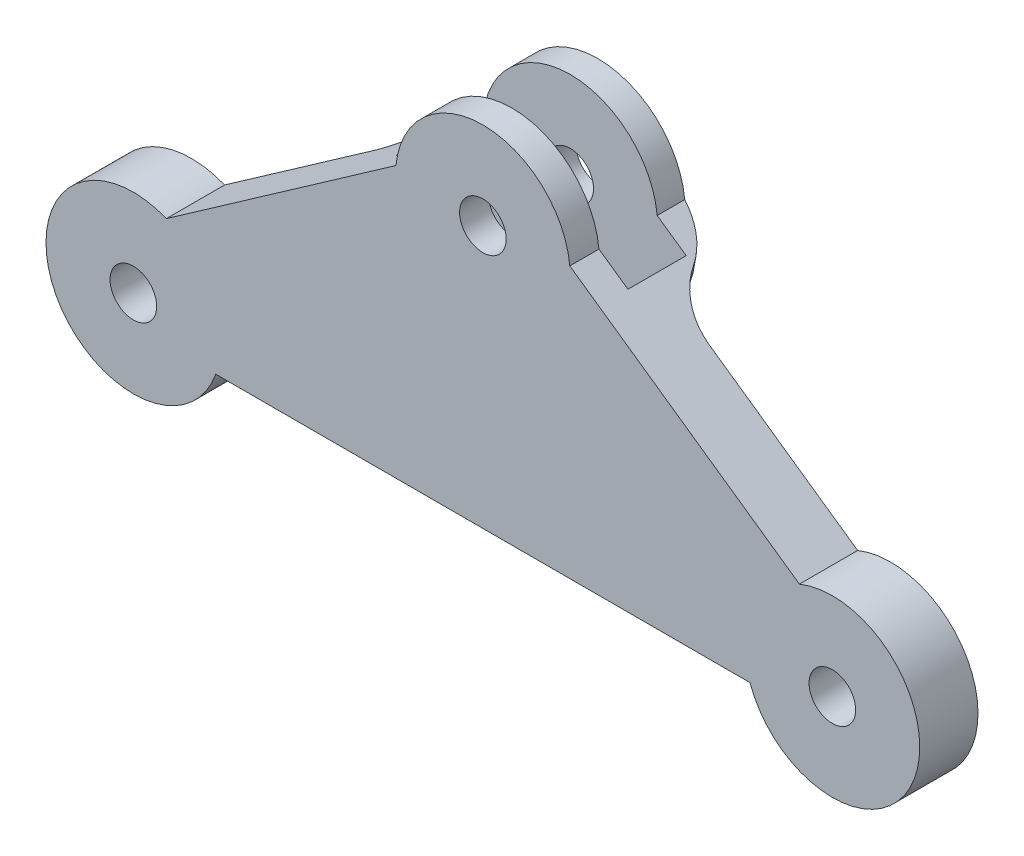
ISO-10303-21;
HEADER;
FILE_DESCRIPTION(('STEP AP214'),'2;1');
FILE_NAME('part.step','',(''),(''),'','','');
FILE_SCHEMA(('AUTOMOTIVE_DESIGN { 1 0 10303 214 1 1 1 1 }'));
ENDSEC;
DATA;
#1=APPLICATION_CONTEXT('core data for automotive mechanical design processes');
#2=APPLICATION_PROTOCOL_DEFINITION('international standard','automotive_design',2000,#1);
#3=PRODUCT_CONTEXT('',#1,'mechanical');
#4=PRODUCT('Part','Part','',(#3));
#5=PRODUCT_RELATED_PRODUCT_CATEGORY('part','',(#4));
#6=PRODUCT_DEFINITION_FORMATION('','',#4);
#7=PRODUCT_DEFINITION_CONTEXT('part definition',#1,'design');
#8=PRODUCT_DEFINITION('design','',#6,#7);
#9=PRODUCT_DEFINITION_SHAPE('','',#8);
#10=(LENGTH_UNIT() NAMED_UNIT(*) SI_UNIT(.MILLI.,.METRE.));
#11=(NAMED_UNIT(*) PLANE_ANGLE_UNIT() SI_UNIT($,.RADIAN.));
#12=(NAMED_UNIT(*) SI_UNIT($,.STERADIAN.) SOLID_ANGLE_UNIT());
#13=UNCERTAINTY_MEASURE_WITH_UNIT(LENGTH_MEASURE(1.E-05),#10,'distance_accuracy_value','');
#14=(GEOMETRIC_REPRESENTATION_CONTEXT(3) GLOBAL_UNCERTAINTY_ASSIGNED_CONTEXT((#13)) GLOBAL_UNIT_ASSIGNED_CONTEXT((#10,
#11,#12)) REPRESENTATION_CONTEXT('',''));
#15=CARTESIAN_POINT('',(0.,0.,0.));
#16=DIRECTION('',(0.,0.,1.));
#17=DIRECTION('',(1.,0.,0.));
#18=AXIS2_PLACEMENT_3D('',#15,#16,#17);
#19=CARTESIAN_POINT('',(60.0000000000001,40.,20.));
#20=DIRECTION('',(0.,0.,-1.));
#21=DIRECTION('',(-1.,0.,0.));
#22=AXIS2_PLACEMENT_3D('',#19,#20,#21);
#23=CYLINDRICAL_SURFACE('',#22,15.);
#24=CARTESIAN_POINT('',(60.0000000000001,40.,5.));
#25=DIRECTION('',(0.,0.,1.));
#26=DIRECTION('',(1.,0.,0.));
#27=AXIS2_PLACEMENT_3D('',#24,#25,#26);
#28=CIRCLE('',#27,15.);
#29=CARTESIAN_POINT('',(74.9259799150159,41.4883291223871,5.));
#30=VERTEX_POINT('',#29);
#31=CARTESIAN_POINT('',(45.0740200849843,41.4883291223871,5.));
#32=VERTEX_POINT('',#31);
#33=EDGE_CURVE('E133',#30,#32,#28,.T.);
#34=ORIENTED_EDGE('',*,*,#33,.F.);
#35=DIRECTION('',(0.,0.,-1.));
#36=VECTOR('',#35,1.);
#37=CARTESIAN_POINT('',(74.9259799150159,41.4883291223871,20.));
#38=LINE('',#37,#36);
#39=CARTESIAN_POINT('',(74.9259799150159,41.4883291223871,0.272963335595823));
#40=VERTEX_POINT('',#39);
#41=EDGE_CURVE('E212',#30,#40,#38,.T.);
#42=ORIENTED_EDGE('',*,*,#41,.T.);
#43=CARTESIAN_POINT('',(60.,40.,0.272963335595823));
#44=DIRECTION('',(0.,0.,1.));
#45=DIRECTION('',(1.,0.,0.));
#46=AXIS2_PLACEMENT_3D('',#43,#44,#45);
#47=CIRCLE('',#46,15.);
#48=CARTESIAN_POINT('',(45.0740200849843,41.4883291223871,0.272963335595816));
#49=VERTEX_POINT('',#48);
#50=EDGE_CURVE('E275',#40,#49,#47,.T.);
#51=ORIENTED_EDGE('',*,*,#50,.T.);
#52=DIRECTION('',(0.,0.,-1.));
#53=VECTOR('',#52,1.);
#54=CARTESIAN_POINT('',(45.0740200849843,41.4883291223871,20.));
#55=LINE('',#54,#53);
#56=EDGE_CURVE('E210',#32,#49,#55,.T.);
#57=ORIENTED_EDGE('',*,*,#56,.F.);
#58=EDGE_LOOP('',(#34,#42,#51,#57));
#59=FACE_BOUND('',#58,.T.);
#60=ADVANCED_FACE('F39',(#59),#23,.T.);
#61=CARTESIAN_POINT('',(60.0000000000001,40.,20.));
#62=DIRECTION('',(0.,0.,-1.));
#63=DIRECTION('',(-1.,0.,0.));
#64=AXIS2_PLACEMENT_3D('',#61,#62,#63);
#65=CYLINDRICAL_SURFACE('',#64,4.00000000000001);
#66=CARTESIAN_POINT('',(60.0000000000001,40.,0.));
#67=DIRECTION('',(0.,0.,1.));
#68=DIRECTION('',(1.,0.,0.));
#69=AXIS2_PLACEMENT_3D('',#66,#67,#68);
#70=CIRCLE('',#69,4.00000000000001);
#71=CARTESIAN_POINT('',(64.0000000000001,40.,0.));
#72=VERTEX_POINT('',#71);
#73=EDGE_CURVE('E188',#72,#72,#70,.T.);
#74=ORIENTED_EDGE('',*,*,#73,.F.);
#75=EDGE_LOOP('',(#74));
#76=FACE_BOUND('',#75,.T.);
#77=CARTESIAN_POINT('',(60.0000000000001,40.,5.));
#78=DIRECTION('',(0.,0.,1.));
#79=DIRECTION('',(1.,0.,0.));
#80=AXIS2_PLACEMENT_3D('',#77,#78,#79);
#81=CIRCLE('',#80,4.00000000000001);
#82=CARTESIAN_POINT('',(64.0000000000001,40.,5.));
#83=VERTEX_POINT('',#82);
#84=EDGE_CURVE('E283',#83,#83,#81,.T.);
#85=ORIENTED_EDGE('',*,*,#84,.T.);
#86=EDGE_LOOP('',(#85));
#87=FACE_BOUND('',#86,.T.);
#88=ADVANCED_FACE('F333',(#76,#87),#65,.F.);
#89=CARTESIAN_POINT('',(0.,0.,0.));
#90=DIRECTION('',(0.,0.,1.));
#91=DIRECTION('',(1.,0.,0.));
#92=AXIS2_PLACEMENT_3D('',#89,#90,#91);
#93=PLANE('',#92);
#94=CARTESIAN_POINT('',(60.,40.,0.));
#95=DIRECTION('',(0.,0.,1.));
#96=DIRECTION('',(1.,0.,0.));
#97=AXIS2_PLACEMENT_3D('',#94,#95,#96);
#98=CIRCLE('',#97,12.6794919243112);
#99=CARTESIAN_POINT('',(72.5645259644283,38.296414737111,0.));
#100=VERTEX_POINT('',#99);
#101=EDGE_CURVE('E61',#100,#100,#98,.F.);
#102=ORIENTED_EDGE('',*,*,#101,.T.);
#103=EDGE_LOOP('',(#102));
#104=FACE_BOUND('',#103,.T.);
#105=ORIENTED_EDGE('',*,*,#73,.T.);
#106=EDGE_LOOP('',(#105));
#107=FACE_BOUND('',#106,.T.);
#108=ADVANCED_FACE('F253',(#104,#107),#93,.F.);
#109=CARTESIAN_POINT('',(0.,0.,20.));
#110=DIRECTION('',(0.,0.,-1.));
#111=DIRECTION('',(-1.,0.,0.));
#112=AXIS2_PLACEMENT_3D('',#109,#110,#111);
#113=CYLINDRICAL_SURFACE('',#112,15.);
#114=CARTESIAN_POINT('',(0.,0.,10.));
#115=DIRECTION('',(0.,0.,-1.));
#116=DIRECTION('',(-1.,0.,0.));
#117=AXIS2_PLACEMENT_3D('',#114,#115,#116);
#118=CIRCLE('',#117,15.);
#119=CARTESIAN_POINT('',(14.142135623731,-5.,10.));
#120=VERTEX_POINT('',#119);
#121=CARTESIAN_POINT('',(5.66074705825357,13.8908582435527,10.));
#122=VERTEX_POINT('',#121);
#123=EDGE_CURVE('E171',#120,#122,#118,.T.);
#124=ORIENTED_EDGE('',*,*,#123,.F.);
#125=DIRECTION('',(0.,0.,-1.));
#126=VECTOR('',#125,1.);
#127=CARTESIAN_POINT('',(14.142135623731,-5.,20.));
#128=LINE('',#127,#126);
#129=CARTESIAN_POINT('',(14.142135623731,-5.,20.));
#130=VERTEX_POINT('',#129);
#131=EDGE_CURVE('E222',#130,#120,#128,.T.);
#132=ORIENTED_EDGE('',*,*,#131,.F.);
#133=CARTESIAN_POINT('',(0.,0.,20.));
#134=DIRECTION('',(0.,0.,1.));
#135=DIRECTION('',(1.,0.,0.));
#136=AXIS2_PLACEMENT_3D('',#133,#134,#135);
#137=CIRCLE('',#136,15.);
#138=CARTESIAN_POINT('',(5.66074705825357,13.8908582435527,20.));
#139=VERTEX_POINT('',#138);
#140=EDGE_CURVE('E192',#139,#130,#137,.T.);
#141=ORIENTED_EDGE('',*,*,#140,.F.);
#142=DIRECTION('',(0.,0.,-1.));
#143=VECTOR('',#142,1.);
#144=CARTESIAN_POINT('',(5.66074705825357,13.8908582435527,20.));
#145=LINE('',#144,#143);
#146=EDGE_CURVE('E207',#139,#122,#145,.T.);
#147=ORIENTED_EDGE('',*,*,#146,.T.);
#148=EDGE_LOOP('',(#124,#132,#141,#147));
#149=FACE_BOUND('',#148,.T.);
#150=ADVANCED_FACE('F248',(#149),#113,.T.);
#151=CARTESIAN_POINT('',(105.857864376269,-5.,20.));
#152=DIRECTION('',(0.,1.,0.));
#153=DIRECTION('',(-1.,0.,0.));
#154=AXIS2_PLACEMENT_3D('',#151,#152,#153);
#155=PLANE('',#154);
#156=DIRECTION('',(-1.,0.,0.));
#157=VECTOR('',#156,1.);
#158=CARTESIAN_POINT('',(0.,-5.,10.));
#159=LINE('',#158,#157);
#160=CARTESIAN_POINT('',(105.857864376269,-5.,10.));
#161=VERTEX_POINT('',#160);
#162=EDGE_CURVE('E169',#161,#120,#159,.T.);
#163=ORIENTED_EDGE('',*,*,#162,.F.);
#164=DIRECTION('',(0.,0.,-1.));
#165=VECTOR('',#164,1.);
#166=CARTESIAN_POINT('',(105.857864376269,-5.,20.));
#167=LINE('',#166,#165);
#168=CARTESIAN_POINT('',(105.857864376269,-5.,20.));
#169=VERTEX_POINT('',#168);
#170=EDGE_CURVE('E219',#169,#161,#167,.T.);
#171=ORIENTED_EDGE('',*,*,#170,.F.);
#172=DIRECTION('',(1.,0.,0.));
#173=VECTOR('',#172,1.);
#174=CARTESIAN_POINT('',(105.857864376269,-5.,20.));
#175=LINE('',#174,#173);
#176=EDGE_CURVE('E197',#130,#169,#175,.T.);
#177=ORIENTED_EDGE('',*,*,#176,.F.);
#178=ORIENTED_EDGE('',*,*,#131,.T.);
#179=EDGE_LOOP('',(#163,#171,#177,#178));
#180=FACE_BOUND('',#179,.T.);
#181=ADVANCED_FACE('F252',(#180),#155,.F.);
#182=CARTESIAN_POINT('',(120.,0.,20.));
#183=DIRECTION('',(0.,0.,-1.));
#184=DIRECTION('',(-1.,0.,0.));
#185=AXIS2_PLACEMENT_3D('',#182,#183,#184);
#186=CYLINDRICAL_SURFACE('',#185,15.);
#187=CARTESIAN_POINT('',(120.,0.,10.));
#188=DIRECTION('',(0.,0.,-1.));
#189=DIRECTION('',(-1.,0.,0.));
#190=AXIS2_PLACEMENT_3D('',#187,#188,#189);
#191=CIRCLE('',#190,15.);
#192=CARTESIAN_POINT('',(114.339252941747,13.8908582435527,10.));
#193=VERTEX_POINT('',#192);
#194=EDGE_CURVE('E167',#193,#161,#191,.T.);
#195=ORIENTED_EDGE('',*,*,#194,.F.);
#196=DIRECTION('',(0.,0.,-1.));
#197=VECTOR('',#196,1.);
#198=CARTESIAN_POINT('',(114.339252941747,13.8908582435527,20.));
#199=LINE('',#198,#197);
#200=CARTESIAN_POINT('',(114.339252941747,13.8908582435527,20.));
#201=VERTEX_POINT('',#200);
#202=EDGE_CURVE('E216',#201,#193,#199,.T.);
#203=ORIENTED_EDGE('',*,*,#202,.F.);
#204=CARTESIAN_POINT('',(120.,0.,20.));
#205=DIRECTION('',(0.,0.,1.));
#206=DIRECTION('',(1.,0.,0.));
#207=AXIS2_PLACEMENT_3D('',#204,#205,#206);
#208=CIRCLE('',#207,15.);
#209=EDGE_CURVE('E199',#169,#201,#208,.T.);
#210=ORIENTED_EDGE('',*,*,#209,.F.);
#211=ORIENTED_EDGE('',*,*,#170,.T.);
#212=EDGE_LOOP('',(#195,#203,#210,#211));
#213=FACE_BOUND('',#212,.T.);
#214=ADVANCED_FACE('F257',(#213),#186,.T.);
#215=CARTESIAN_POINT('',(74.9259799150159,41.4883291223871,20.));
#216=DIRECTION('',(-0.573576436351047,-0.819152044288991,0.));
#217=DIRECTION('',(0.819152044288991,-0.573576436351047,0.));
#218=AXIS2_PLACEMENT_3D('',#215,#216,#217);
#219=PLANE('',#218);
#220=DIRECTION('',(0.,0.,-1.));
#221=VECTOR('',#220,1.);
#222=CARTESIAN_POINT('',(79.9002794082404,38.0052871199185,15.));
#223=LINE('',#222,#221);
#224=CARTESIAN_POINT('',(79.9002794082404,38.0052871199185,15.));
#225=VERTEX_POINT('',#224);
#226=CARTESIAN_POINT('',(79.9002794082404,38.0052871199185,5.));
#227=VERTEX_POINT('',#226);
#228=EDGE_CURVE('E143',#225,#227,#223,.T.);
#229=ORIENTED_EDGE('',*,*,#228,.F.);
#230=DIRECTION('',(-0.819152044288991,0.573576436351047,0.));
#231=VECTOR('',#230,1.);
#232=CARTESIAN_POINT('',(74.9259799150159,41.4883291223871,15.));
#233=LINE('',#232,#231);
#234=CARTESIAN_POINT('',(74.9259799150159,41.4883291223871,15.));
#235=VERTEX_POINT('',#234);
#236=EDGE_CURVE('E155',#225,#235,#233,.T.);
#237=ORIENTED_EDGE('',*,*,#236,.T.);
#238=CARTESIAN_POINT('',(74.9259799150159,41.4883291223871,20.));
#239=VERTEX_POINT('',#238);
#240=EDGE_CURVE('E213',#239,#235,#38,.T.);
#241=ORIENTED_EDGE('',*,*,#240,.F.);
#242=DIRECTION('',(-0.819152044288991,0.573576436351047,0.));
#243=VECTOR('',#242,1.);
#244=CARTESIAN_POINT('',(74.9259799150159,41.4883291223871,20.));
#245=LINE('',#244,#243);
#246=EDGE_CURVE('E201',#201,#239,#245,.T.);
#247=ORIENTED_EDGE('',*,*,#246,.F.);
#248=ORIENTED_EDGE('',*,*,#202,.T.);
#249=DIRECTION('',(0.819152044288991,-0.573576436351047,0.));
#250=VECTOR('',#249,1.);
#251=CARTESIAN_POINT('',(44.1430311253552,63.042781913231,10.));
#252=LINE('',#251,#250);
#253=CARTESIAN_POINT('',(88.8417291860941,31.7444165829418,10.));
#254=VERTEX_POINT('',#253);
#255=EDGE_CURVE('E165',#254,#193,#252,.T.);
#256=ORIENTED_EDGE('',*,*,#255,.F.);
#257=CARTESIAN_POINT('',(88.8417291860941,31.7444165829418,10.));
#258=CARTESIAN_POINT('',(88.5788646634974,31.9284763031919,10.0000255001792));
#259=CARTESIAN_POINT('',(88.3160233764491,32.1125197537359,9.986196673985));
#260=CARTESIAN_POINT('',(87.7922957510652,32.4792377849983,9.93132691072668));
#261=CARTESIAN_POINT('',(87.5314090843992,32.6619125956163,9.89029065244057));
#262=CARTESIAN_POINT('',(87.0135741722543,33.0245045046483,9.78153723800248));
#263=CARTESIAN_POINT('',(86.7566235005208,33.2044233019442,9.71383726734733));
#264=CARTESIAN_POINT('',(86.2482647211369,33.5603799513839,9.55239839257563));
#265=CARTESIAN_POINT('',(85.9968567882128,33.736417681183,9.45865866885919));
#266=CARTESIAN_POINT('',(85.5014077056254,34.0833348636098,9.24590383294871));
#267=CARTESIAN_POINT('',(85.2573643866132,34.2542158352319,9.12689624841612));
#268=CARTESIAN_POINT('',(84.7781930723212,34.589735201593,8.86435599082266));
#269=CARTESIAN_POINT('',(84.5430681806626,34.7543714231531,8.72081487403467));
#270=CARTESIAN_POINT('',(84.0835121822615,35.076155997463,8.41010845893162));
#271=CARTESIAN_POINT('',(83.8590817295176,35.2333038922781,8.24294171830831));
#272=CARTESIAN_POINT('',(83.4226471533981,35.5388986724123,7.8859385531512));
#273=CARTESIAN_POINT('',(83.2106432971542,35.6873453706839,7.69610164154823));
#274=CARTESIAN_POINT('',(82.8005301683392,35.9745096749989,7.29449587586368));
#275=CARTESIAN_POINT('',(82.6024420040204,36.113212500885,7.08269486077136));
#276=CARTESIAN_POINT('',(82.222433751622,36.3792971437963,6.6386351492714));
#277=CARTESIAN_POINT('',(82.0405069863331,36.5066836362537,6.40638498130754));
#278=CARTESIAN_POINT('',(81.6946172778975,36.7488782174894,5.92259355518975));
#279=CARTESIAN_POINT('',(81.5306593095647,36.8636828228656,5.67104698726753));
#280=CARTESIAN_POINT('',(81.2228064617358,37.0792437075748,5.15027768461252));
#281=CARTESIAN_POINT('',(81.0789090066768,37.1800017903362,4.88105722556539));
#282=CARTESIAN_POINT('',(80.8225069046717,37.3595364749731,4.34611717396494));
#283=CARTESIAN_POINT('',(80.7085132309154,37.4393557046454,4.08146151289112));
#284=CARTESIAN_POINT('',(80.5013466891215,37.5844152788743,3.54028919713725));
#285=CARTESIAN_POINT('',(80.4081700253046,37.6496582812641,3.26377471577602));
#286=CARTESIAN_POINT('',(80.2443579515243,37.7643607301749,2.70166215618057));
#287=CARTESIAN_POINT('',(80.173671497133,37.813855918389,2.41608628901334));
#288=CARTESIAN_POINT('',(80.0559044549062,37.8963172891089,1.83791573454646));
#289=CARTESIAN_POINT('',(80.0088080313391,37.9292945599133,1.54532589427546));
#290=CARTESIAN_POINT('',(79.9494741133309,37.9708406165742,1.04349446731837));
#291=CARTESIAN_POINT('',(79.9310371056768,37.9837503483156,0.83531723647192));
#292=CARTESIAN_POINT('',(79.9064370265588,38.0009755091545,0.418104938181707));
#293=CARTESIAN_POINT('',(79.9002611480739,38.0052999058247,0.209070994606123));
#294=CARTESIAN_POINT('',(79.9002794082404,38.0052871199185,0.));
#295=B_SPLINE_CURVE_WITH_KNOTS('',3,(#257,#258,#259,#260,#261,#262,#263,#264,#265,#266,#267,
#268,#269,#270,#271,#272,#273,#274,#275,#276,#277,#278,#279,#280,#281,#282,#283,#284,#285,#286,
#287,#288,#289,#290,#291,#292,#293,#294),.UNSPECIFIED.,.F.,.F.,(4,2,2,2,2,2,2,2,2,2,2,2,2,2,2,2,
2,2,4),(0.,0.962356526071985,1.92454760157603,2.88611953065247,3.84772172858584,
4.80903785226378,5.77068550165329,6.73239188354244,7.69411893143467,8.65727462599246,
9.62003051624308,10.5830522838345,11.5459502952782,12.4417330517644,13.3373523374264,
14.2309241546345,15.1238953201716,15.7515580239126,16.3785647744018),.UNSPECIFIED.);
#296=CARTESIAN_POINT('',(81.1462567913851,37.1328443638018,5.00000000000178));
#297=VERTEX_POINT('',#296);
#298=EDGE_CURVE('E233',#254,#297,#295,.T.);
#299=ORIENTED_EDGE('',*,*,#298,.T.);
#300=CARTESIAN_POINT('',(81.1462567913841,37.1328443638025,5.));
#301=CARTESIAN_POINT('',(81.0813317284569,37.1783053822828,4.87798567770648));
#302=CARTESIAN_POINT('',(81.0141269923752,37.2253626450906,4.75780595543095));
#303=CARTESIAN_POINT('',(80.8753295721159,37.3225496450403,4.52129485162238));
#304=CARTESIAN_POINT('',(80.8037371659757,37.3726791874982,4.4049632269612));
#305=CARTESIAN_POINT('',(80.5827468021,37.5274183061557,4.06217879105021));
#306=CARTESIAN_POINT('',(80.427025844194,37.6364552947387,3.84173046370002));
#307=CARTESIAN_POINT('',(80.1022161321694,37.8638895035821,3.42068800503808));
#308=CARTESIAN_POINT('',(79.9332932931711,37.9821705488244,3.21990212758247));
#309=CARTESIAN_POINT('',(79.5821867919866,38.2280179676683,2.8363874075259));
#310=CARTESIAN_POINT('',(79.4000016907361,38.3555853489134,2.65366052956139));
#311=CARTESIAN_POINT('',(79.0244165783448,38.6185728758491,2.30732784043118));
#312=CARTESIAN_POINT('',(78.8310397335752,38.753976800272,2.14368450601262));
#313=CARTESIAN_POINT('',(78.4343460940479,39.0317446770288,1.83545036141048));
#314=CARTESIAN_POINT('',(78.2310282759125,39.1741093459396,1.69086151848544));
#315=CARTESIAN_POINT('',(77.8148867583245,39.4654947735168,1.42007841356208));
#316=CARTESIAN_POINT('',(77.6020162161403,39.6145483318169,1.2939916563296));
#317=CARTESIAN_POINT('',(77.1693965265858,39.9174718996209,1.06098378655808));
#318=CARTESIAN_POINT('',(76.9496476476513,40.071341721164,0.954061927177244));
#319=CARTESIAN_POINT('',(76.4069558361756,40.451338618484,0.716048108351853));
#320=CARTESIAN_POINT('',(76.0810553400192,40.6795366025989,0.594947214473777));
#321=CARTESIAN_POINT('',(75.4213777532882,41.141447821616,0.389029578535949));
#322=CARTESIAN_POINT('',(75.0875924839222,41.3751667833695,0.304252430671791));
#323=CARTESIAN_POINT('',(74.5851558003418,41.7269767366855,0.202206613691951));
#324=CARTESIAN_POINT('',(74.4181226904921,41.8439345793329,0.172454606432859));
#325=CARTESIAN_POINT('',(74.0832437635004,42.0784193284,0.120567273964103));
#326=CARTESIAN_POINT('',(73.9153978842294,42.1959462783231,0.0984325406540384));
#327=CARTESIAN_POINT('',(73.579611205463,42.4310666420257,0.0612977167867671));
#328=CARTESIAN_POINT('',(73.4116716914499,42.5486591557009,0.04627993439511));
#329=CARTESIAN_POINT('',(73.0755309311916,42.7840274499333,0.022704403896345));
#330=CARTESIAN_POINT('',(72.9073297665458,42.901803173354,0.0141449367194662));
#331=CARTESIAN_POINT('',(72.7390783373358,43.0196140924013,0.00851448376966913));
#332=B_SPLINE_CURVE_WITH_KNOTS('',3,(#300,#301,#302,#303,#304,#305,#306,#307,#308,#309,#310,
#311,#312,#313,#314,#315,#316,#317,#318,#319,#320,#321,#322,#323,#324,#325,#326,#327,#328,#329,
#330,#331),.UNSPECIFIED.,.F.,.F.,(4,2,2,2,2,2,2,2,2,2,2,2,2,2,2,4),(0.,0.436410591352148,
0.872793556809297,1.74482489303898,2.60726247602928,3.46979378046194,4.33059945820407,
5.1914939393054,6.05720774358409,6.92288780430292,8.16854740754378,9.41556139156545,
10.0336513968776,10.6517894199799,11.2683826639199,11.884811725551),.UNSPECIFIED.);
#333=EDGE_CURVE('E268',#297,#40,#332,.T.);
#334=ORIENTED_EDGE('',*,*,#333,.T.);
#335=ORIENTED_EDGE('',*,*,#41,.F.);
#336=DIRECTION('',(-0.819152044288991,0.573576436351047,0.));
#337=VECTOR('',#336,1.);
#338=CARTESIAN_POINT('',(74.9259799150159,41.4883291223871,5.));
#339=LINE('',#338,#337);
#340=EDGE_CURVE('E55',#227,#30,#339,.T.);
#341=ORIENTED_EDGE('',*,*,#340,.F.);
#342=EDGE_LOOP('',(#229,#237,#241,#247,#248,#256,#299,#334,#335,#341));
#343=FACE_BOUND('',#342,.T.);
#344=ADVANCED_FACE('F260',(#343),#219,.F.);
#345=CARTESIAN_POINT('',(5.66074705825357,13.8908582435527,20.));
#346=DIRECTION('',(0.573576436351047,-0.819152044288991,0.));
#347=DIRECTION('',(0.819152044288991,0.573576436351047,0.));
#348=AXIS2_PLACEMENT_3D('',#345,#346,#347);
#349=PLANE('',#348);
#350=CARTESIAN_POINT('',(45.0740200849843,41.4883291223871,20.));
#351=VERTEX_POINT('',#350);
#352=CARTESIAN_POINT('',(45.0740200849843,41.4883291223871,15.));
#353=VERTEX_POINT('',#352);
#354=EDGE_CURVE('E152',#351,#353,#55,.T.);
#355=ORIENTED_EDGE('',*,*,#354,.T.);
#356=DIRECTION('',(-0.819152044288991,-0.573576436351047,0.));
#357=VECTOR('',#356,1.);
#358=CARTESIAN_POINT('',(5.66074705825357,13.8908582435527,15.));
#359=LINE('',#358,#357);
#360=CARTESIAN_POINT('',(40.0997205917596,38.0052871199184,15.));
#361=VERTEX_POINT('',#360);
#362=EDGE_CURVE('E149',#353,#361,#359,.T.);
#363=ORIENTED_EDGE('',*,*,#362,.T.);
#364=DIRECTION('',(0.,0.,-1.));
#365=VECTOR('',#364,1.);
#366=CARTESIAN_POINT('',(40.0997205917596,38.0052871199184,15.));
#367=LINE('',#366,#365);
#368=CARTESIAN_POINT('',(40.0997205917596,38.0052871199184,5.));
#369=VERTEX_POINT('',#368);
#370=EDGE_CURVE('E11',#369,#361,#367,.F.);
#371=ORIENTED_EDGE('',*,*,#370,.F.);
#372=DIRECTION('',(-0.819152044288991,-0.573576436351047,0.));
#373=VECTOR('',#372,1.);
#374=CARTESIAN_POINT('',(5.66074705825357,13.8908582435527,5.));
#375=LINE('',#374,#373);
#376=EDGE_CURVE('E129',#32,#369,#375,.T.);
#377=ORIENTED_EDGE('',*,*,#376,.F.);
#378=ORIENTED_EDGE('',*,*,#56,.T.);
#379=CARTESIAN_POINT('',(45.0740200849842,41.488329122387,0.272963335595815));
#380=CARTESIAN_POINT('',(44.9450438492262,41.3980189898593,0.301441533586815));
#381=CARTESIAN_POINT('',(44.8164430085291,41.3079717117831,0.33241401620311));
#382=CARTESIAN_POINT('',(44.5601366775029,41.1285040867077,0.399544268717578));
#383=CARTESIAN_POINT('',(44.4324313028554,41.0390838207096,0.435702696077677));
#384=CARTESIAN_POINT('',(44.0507045407239,40.7717958643288,0.552307410292352));
#385=CARTESIAN_POINT('',(43.7982959475092,40.5950574646509,0.640834592549762));
#386=CARTESIAN_POINT('',(43.2980566086797,40.2447861086935,0.841167810964573));
#387=CARTESIAN_POINT('',(43.0502626504483,40.071278911217,0.953111014715926));
#388=CARTESIAN_POINT('',(42.562819259832,39.729967374657,1.2007120275425));
#389=CARTESIAN_POINT('',(42.3231667371835,39.5621608717475,1.33636071578411));
#390=CARTESIAN_POINT('',(41.8739509891355,39.2476166186818,1.61922405473557));
#391=CARTESIAN_POINT('',(41.6635604088024,39.1002995483643,1.76447962279021));
#392=CARTESIAN_POINT('',(41.2529159139683,38.8127631775571,2.07520440014704));
#393=CARTESIAN_POINT('',(41.0526654499514,38.6725462931224,2.24068042556481));
#394=CARTESIAN_POINT('',(40.6649231033736,38.4010461791655,2.59074160723918));
#395=CARTESIAN_POINT('',(40.477383311388,38.269729403103,2.77524753444843));
#396=CARTESIAN_POINT('',(40.1160288166337,38.01670626191,3.1631321369942));
#397=CARTESIAN_POINT('',(39.9422075267615,37.8949952844402,3.36650165144872));
#398=CARTESIAN_POINT('',(39.6095608680412,37.662073586444,3.79162901887604));
#399=CARTESIAN_POINT('',(39.450768347377,37.5508858664635,4.01342524800175));
#400=CARTESIAN_POINT('',(39.150290863839,37.340489267428,4.47363712496346));
#401=CARTESIAN_POINT('',(39.0086044486453,37.2412793714474,4.7120513592048));
#402=CARTESIAN_POINT('',(38.7425786195912,37.0550060805853,5.20628735518684));
#403=CARTESIAN_POINT('',(38.6184205032269,36.9680696315771,5.46225534685087));
#404=CARTESIAN_POINT('',(38.447528966753,36.8484100895218,5.85611899143741));
#405=CARTESIAN_POINT('',(38.3931037485393,36.8103011414598,5.98911483533084));
#406=CARTESIAN_POINT('',(38.2895275329724,36.7377762945407,6.25814305337251));
#407=CARTESIAN_POINT('',(38.2403768827285,36.703360638732,6.39417562665137));
#408=CARTESIAN_POINT('',(38.1939347227056,36.6708414881932,6.53159924422219));
#409=B_SPLINE_CURVE_WITH_KNOTS('',3,(#379,#380,#381,#382,#383,#384,#385,#386,#387,#388,#389,
#390,#391,#392,#393,#394,#395,#396,#397,#398,#399,#400,#401,#402,#403,#404,#405,#406,#407,#408),
.UNSPECIFIED.,.F.,.F.,(4,2,2,2,2,2,2,2,2,2,2,2,2,2,4),(0.,0.479978421846198,0.960017748109193,
1.92092581752942,2.88762881297007,3.85396067900573,4.73826841721057,5.6228750733862,
6.50393702978823,7.38457332682823,8.26709199680085,9.14953568757026,10.0405259206856,
10.4863832715589,10.9322699454841),.UNSPECIFIED.);
#410=CARTESIAN_POINT('',(38.8537432086164,37.1328443638027,4.99999999999915));
#411=VERTEX_POINT('',#410);
#412=EDGE_CURVE('E48',#49,#411,#409,.T.);
#413=ORIENTED_EDGE('',*,*,#412,.T.);
#414=CARTESIAN_POINT('',(40.0997205917596,38.0052871199184,0.));
#415=CARTESIAN_POINT('',(40.0997218477361,38.0052879993626,0.129598000573221));
#416=CARTESIAN_POINT('',(40.0973541126075,38.0036300933771,0.259178343966597));
#417=CARTESIAN_POINT('',(40.0878991978469,37.9970096907886,0.5180768446117));
#418=CARTESIAN_POINT('',(40.0808122155144,37.9920473323362,0.647395012597603));
#419=CARTESIAN_POINT('',(40.0525126067851,37.9722317329756,1.03445849648521));
#420=CARTESIAN_POINT('',(40.0242612664563,37.9524499315127,1.29148782135104));
#421=CARTESIAN_POINT('',(39.9496158543415,37.9001826512572,1.80025686918969));
#422=CARTESIAN_POINT('',(39.9033101477243,37.8677590464217,2.05201615641389));
#423=CARTESIAN_POINT('',(39.7932391990625,37.7906865384309,2.54979649601731));
#424=CARTESIAN_POINT('',(39.7294726813763,37.7460367420616,2.79581712771956));
#425=CARTESIAN_POINT('',(39.5854816325063,37.6452131242081,3.28007895096952));
#426=CARTESIAN_POINT('',(39.5052853129989,37.5890590567523,3.51833267686929));
#427=CARTESIAN_POINT('',(39.3293307667467,37.4658543570843,3.98620498003771));
#428=CARTESIAN_POINT('',(39.2335666346561,37.3987995899043,4.21582023961135));
#429=CARTESIAN_POINT('',(39.0274761238317,37.2544934606716,4.66529498463727));
#430=CARTESIAN_POINT('',(38.9171400170298,37.1772352869522,4.88514782064032));
#431=CARTESIAN_POINT('',(38.6830227749041,37.0133046291909,5.31395719674818));
#432=CARTESIAN_POINT('',(38.5592363877447,36.9266284677742,5.52290943309781));
#433=CARTESIAN_POINT('',(38.1523380267932,36.6417151681507,6.15850514594211));
#434=CARTESIAN_POINT('',(37.8471686997315,36.4280333049118,6.56450253849806));
#435=CARTESIAN_POINT('',(37.1904011576839,35.9681597211186,7.31586605382406));
#436=CARTESIAN_POINT('',(36.8387879996329,35.7219575373176,7.66121257882319));
#437=CARTESIAN_POINT('',(36.2629022711767,35.3187180091051,8.14703559297347));
#438=CARTESIAN_POINT('',(36.0513484387101,35.1705864208749,8.31042587309244));
#439=CARTESIAN_POINT('',(35.618211060371,34.8673003634814,8.61595977605336));
#440=CARTESIAN_POINT('',(35.3966302060317,34.71214777895,8.75810905701403));
#441=CARTESIAN_POINT('',(34.9448344615739,34.3957969929497,9.02043513431921));
#442=CARTESIAN_POINT('',(34.7146167403347,34.2345968091085,9.14060464861488));
#443=CARTESIAN_POINT('',(34.2471621560267,33.9072815854054,9.35816472474544));
#444=CARTESIAN_POINT('',(34.0099281047288,33.7411685143665,9.45556427588108));
#445=CARTESIAN_POINT('',(33.558103029722,33.4247971908946,9.61689914583586));
#446=CARTESIAN_POINT('',(33.344129069941,33.2749710112753,9.68342252549821));
#447=CARTESIAN_POINT('',(32.9128833893265,32.9730095348887,9.79786049305399));
#448=CARTESIAN_POINT('',(32.6956120108699,32.8208744778562,9.84577699938104));
#449=CARTESIAN_POINT('',(32.2589168667117,32.515097246017,9.92263672196951));
#450=CARTESIAN_POINT('',(32.0394940104328,32.361455707995,9.95158763136939));
#451=CARTESIAN_POINT('',(31.5994752879185,32.0533512815372,9.9902774504782));
#452=CARTESIAN_POINT('',(31.3788792107559,31.8988882454084,10.0000127797895));
#453=CARTESIAN_POINT('',(31.1582708139059,31.7444165829417,10.));
#454=B_SPLINE_CURVE_WITH_KNOTS('',3,(#414,#415,#416,#417,#418,#419,#420,#421,#422,#423,#424,
#425,#426,#427,#428,#429,#430,#431,#432,#433,#434,#435,#436,#437,#438,#439,#440,#441,#442,#443,
#444,#445,#446,#447,#448,#449,#450,#451,#452,#453),.UNSPECIFIED.,.F.,.F.,(4,2,2,2,2,2,2,2,2,2,2,
2,2,2,2,2,2,2,2,4),(0.,0.388726780101155,0.777437309563549,1.55433515886277,2.32747735571105,
3.10067605140894,3.87255804801385,4.64473352916348,5.41742713565608,6.19042354196554,
7.83637740979228,9.48286215072432,10.3988213755186,11.3145361729975,12.2305538057578,
13.1462091930383,13.9542112969922,14.7621300709738,15.5697209203474,16.3774622321856),.UNSPECIFIED.);
#455=CARTESIAN_POINT('',(31.1582708139059,31.7444165829417,10.));
#456=VERTEX_POINT('',#455);
#457=EDGE_CURVE('E227',#411,#456,#454,.T.);
#458=ORIENTED_EDGE('',*,*,#457,.T.);
#459=DIRECTION('',(0.819152044288991,0.573576436351047,0.));
#460=VECTOR('',#459,1.);
#461=CARTESIAN_POINT('',(-4.66423972489513,6.66122466607635,10.));
#462=LINE('',#461,#460);
#463=EDGE_CURVE('E173',#122,#456,#462,.T.);
#464=ORIENTED_EDGE('',*,*,#463,.F.);
#465=ORIENTED_EDGE('',*,*,#146,.F.);
#466=DIRECTION('',(-0.819152044288991,-0.573576436351047,0.));
#467=VECTOR('',#466,1.);
#468=CARTESIAN_POINT('',(5.66074705825357,13.8908582435527,20.));
#469=LINE('',#468,#467);
#470=EDGE_CURVE('E205',#351,#139,#469,.T.);
#471=ORIENTED_EDGE('',*,*,#470,.F.);
#472=EDGE_LOOP('',(#355,#363,#371,#377,#378,#413,#458,#464,#465,#471));
#473=FACE_BOUND('',#472,.T.);
#474=ADVANCED_FACE('F148',(#473),#349,.F.);
#475=CARTESIAN_POINT('',(120.,0.,20.));
#476=DIRECTION('',(0.,0.,-1.));
#477=DIRECTION('',(-1.,0.,0.));
#478=AXIS2_PLACEMENT_3D('',#475,#476,#477);
#479=CYLINDRICAL_SURFACE('',#478,4.00000000000001);
#480=CARTESIAN_POINT('',(120.,0.,20.));
#481=DIRECTION('',(0.,0.,1.));
#482=DIRECTION('',(1.,0.,0.));
#483=AXIS2_PLACEMENT_3D('',#480,#481,#482);
#484=CIRCLE('',#483,4.00000000000001);
#485=CARTESIAN_POINT('',(124.,0.,20.));
#486=VERTEX_POINT('',#485);
#487=EDGE_CURVE('E185',#486,#486,#484,.T.);
#488=ORIENTED_EDGE('',*,*,#487,.T.);
#489=EDGE_LOOP('',(#488));
#490=FACE_BOUND('',#489,.T.);
#491=CARTESIAN_POINT('',(120.,0.,10.));
#492=DIRECTION('',(0.,0.,-1.));
#493=DIRECTION('',(-1.,0.,0.));
#494=AXIS2_PLACEMENT_3D('',#491,#492,#493);
#495=CIRCLE('',#494,4.00000000000001);
#496=CARTESIAN_POINT('',(116.,0.,10.));
#497=VERTEX_POINT('',#496);
#498=EDGE_CURVE('E179',#497,#497,#495,.F.);
#499=ORIENTED_EDGE('',*,*,#498,.F.);
#500=EDGE_LOOP('',(#499));
#501=FACE_BOUND('',#500,.T.);
#502=ADVANCED_FACE('F352',(#490,#501),#479,.F.);
#503=CARTESIAN_POINT('',(0.,0.,20.));
#504=DIRECTION('',(0.,0.,-1.));
#505=DIRECTION('',(-1.,0.,0.));
#506=AXIS2_PLACEMENT_3D('',#503,#504,#505);
#507=CYLINDRICAL_SURFACE('',#506,4.);
#508=CARTESIAN_POINT('',(0.,0.,20.));
#509=DIRECTION('',(0.,0.,1.));
#510=DIRECTION('',(1.,0.,0.));
#511=AXIS2_PLACEMENT_3D('',#508,#509,#510);
#512=CIRCLE('',#511,4.);
#513=CARTESIAN_POINT('',(4.,0.,20.));
#514=VERTEX_POINT('',#513);
#515=EDGE_CURVE('E182',#514,#514,#512,.T.);
#516=ORIENTED_EDGE('',*,*,#515,.T.);
#517=EDGE_LOOP('',(#516));
#518=FACE_BOUND('',#517,.T.);
#519=CARTESIAN_POINT('',(0.,0.,10.));
#520=DIRECTION('',(0.,0.,-1.));
#521=DIRECTION('',(-1.,0.,0.));
#522=AXIS2_PLACEMENT_3D('',#519,#520,#521);
#523=CIRCLE('',#522,4.);
#524=CARTESIAN_POINT('',(-4.,0.,10.));
#525=VERTEX_POINT('',#524);
#526=EDGE_CURVE('E176',#525,#525,#523,.F.);
#527=ORIENTED_EDGE('',*,*,#526,.F.);
#528=EDGE_LOOP('',(#527));
#529=FACE_BOUND('',#528,.T.);
#530=ADVANCED_FACE('F346',(#518,#529),#507,.F.);
#531=CARTESIAN_POINT('',(0.,0.,20.));
#532=DIRECTION('',(0.,0.,1.));
#533=DIRECTION('',(1.,0.,0.));
#534=AXIS2_PLACEMENT_3D('',#531,#532,#533);
#535=PLANE('',#534);
#536=ORIENTED_EDGE('',*,*,#487,.F.);
#537=EDGE_LOOP('',(#536));
#538=FACE_BOUND('',#537,.T.);
#539=ORIENTED_EDGE('',*,*,#140,.T.);
#540=ORIENTED_EDGE('',*,*,#176,.T.);
#541=ORIENTED_EDGE('',*,*,#209,.T.);
#542=ORIENTED_EDGE('',*,*,#246,.T.);
#543=CARTESIAN_POINT('',(60.0000000000001,40.,20.));
#544=DIRECTION('',(0.,0.,1.));
#545=DIRECTION('',(1.,0.,0.));
#546=AXIS2_PLACEMENT_3D('',#543,#544,#545);
#547=CIRCLE('',#546,15.);
#548=EDGE_CURVE('E203',#239,#351,#547,.T.);
#549=ORIENTED_EDGE('',*,*,#548,.T.);
#550=ORIENTED_EDGE('',*,*,#470,.T.);
#551=EDGE_LOOP('',(#539,#540,#541,#542,#549,#550));
#552=FACE_BOUND('',#551,.T.);
#553=CARTESIAN_POINT('',(60.0000000000001,40.,20.));
#554=DIRECTION('',(0.,0.,1.));
#555=DIRECTION('',(1.,0.,0.));
#556=AXIS2_PLACEMENT_3D('',#553,#554,#555);
#557=CIRCLE('',#556,4.00000000000001);
#558=CARTESIAN_POINT('',(64.0000000000001,40.,20.));
#559=VERTEX_POINT('',#558);
#560=EDGE_CURVE('E189',#559,#559,#557,.T.);
#561=ORIENTED_EDGE('',*,*,#560,.F.);
#562=EDGE_LOOP('',(#561));
#563=FACE_BOUND('',#562,.T.);
#564=ORIENTED_EDGE('',*,*,#515,.F.);
#565=EDGE_LOOP('',(#564));
#566=FACE_BOUND('',#565,.T.);
#567=ADVANCED_FACE('F318',(#538,#552,#563,#566),#535,.T.);
#568=ORIENTED_EDGE('',*,*,#240,.T.);
#569=CARTESIAN_POINT('',(60.0000000000001,40.,15.));
#570=DIRECTION('',(0.,0.,1.));
#571=DIRECTION('',(1.,0.,0.));
#572=AXIS2_PLACEMENT_3D('',#569,#570,#571);
#573=CIRCLE('',#572,15.);
#574=EDGE_CURVE('E156',#235,#353,#573,.T.);
#575=ORIENTED_EDGE('',*,*,#574,.T.);
#576=ORIENTED_EDGE('',*,*,#354,.F.);
#577=ORIENTED_EDGE('',*,*,#548,.F.);
#578=EDGE_LOOP('',(#568,#575,#576,#577));
#579=FACE_BOUND('',#578,.T.);
#580=ADVANCED_FACE('F265',(#579),#23,.T.);
#581=CARTESIAN_POINT('',(60.0000000000001,40.,15.));
#582=DIRECTION('',(0.,0.,1.));
#583=DIRECTION('',(1.,0.,0.));
#584=AXIS2_PLACEMENT_3D('',#581,#582,#583);
#585=CIRCLE('',#584,4.00000000000001);
#586=CARTESIAN_POINT('',(64.0000000000001,40.,15.));
#587=VERTEX_POINT('',#586);
#588=EDGE_CURVE('E160',#587,#587,#585,.T.);
#589=ORIENTED_EDGE('',*,*,#588,.F.);
#590=EDGE_LOOP('',(#589));
#591=FACE_BOUND('',#590,.T.);
#592=ORIENTED_EDGE('',*,*,#560,.T.);
#593=EDGE_LOOP('',(#592));
#594=FACE_BOUND('',#593,.T.);
#595=ADVANCED_FACE('F339',(#591,#594),#65,.F.);
#596=CARTESIAN_POINT('',(0.,0.,10.));
#597=DIRECTION('',(0.,0.,-1.));
#598=DIRECTION('',(-1.,0.,0.));
#599=AXIS2_PLACEMENT_3D('',#596,#597,#598);
#600=PLANE('',#599);
#601=ORIENTED_EDGE('',*,*,#463,.T.);
#602=CARTESIAN_POINT('',(60.,40.,10.));
#603=DIRECTION('',(0.,0.,-1.));
#604=DIRECTION('',(-1.,0.,0.));
#605=AXIS2_PLACEMENT_3D('',#602,#603,#604);
#606=CIRCLE('',#605,30.);
#607=EDGE_CURVE('E225',#456,#254,#606,.F.);
#608=ORIENTED_EDGE('',*,*,#607,.T.);
#609=ORIENTED_EDGE('',*,*,#255,.T.);
#610=ORIENTED_EDGE('',*,*,#194,.T.);
#611=ORIENTED_EDGE('',*,*,#162,.T.);
#612=ORIENTED_EDGE('',*,*,#123,.T.);
#613=EDGE_LOOP('',(#601,#608,#609,#610,#611,#612));
#614=FACE_BOUND('',#613,.T.);
#615=ORIENTED_EDGE('',*,*,#526,.T.);
#616=EDGE_LOOP('',(#615));
#617=FACE_BOUND('',#616,.T.);
#618=ORIENTED_EDGE('',*,*,#498,.T.);
#619=EDGE_LOOP('',(#618));
#620=FACE_BOUND('',#619,.T.);
#621=ADVANCED_FACE('F246',(#614,#617,#620),#600,.T.);
#622=CARTESIAN_POINT('',(60.,40.,0.));
#623=DIRECTION('',(0.,0.,-1.));
#624=DIRECTION('',(-1.,0.,0.));
#625=AXIS2_PLACEMENT_3D('',#622,#623,#624);
#626=TOROIDAL_SURFACE('',#625,30.,10.);
#627=ORIENTED_EDGE('',*,*,#457,.F.);
#628=CARTESIAN_POINT('',(60.,40.,5.));
#629=DIRECTION('',(0.,0.,-1.));
#630=DIRECTION('',(-1.,0.,0.));
#631=AXIS2_PLACEMENT_3D('',#628,#629,#630);
#632=CIRCLE('',#631,21.3397459621556);
#633=EDGE_CURVE('E276',#411,#297,#632,.F.);
#634=ORIENTED_EDGE('',*,*,#633,.T.);
#635=ORIENTED_EDGE('',*,*,#298,.F.);
#636=ORIENTED_EDGE('',*,*,#607,.F.);
#637=EDGE_LOOP('',(#627,#634,#635,#636));
#638=FACE_BOUND('',#637,.T.);
#639=ADVANCED_FACE('F242',(#638),#626,.F.);
#640=CARTESIAN_POINT('',(60.,40.,10.));
#641=DIRECTION('',(0.,0.,-1.));
#642=DIRECTION('',(-1.,0.,0.));
#643=AXIS2_PLACEMENT_3D('',#640,#641,#642);
#644=TOROIDAL_SURFACE('',#643,12.6794919243112,10.);
#645=ORIENTED_EDGE('',*,*,#333,.F.);
#646=ORIENTED_EDGE('',*,*,#633,.F.);
#647=ORIENTED_EDGE('',*,*,#412,.F.);
#648=ORIENTED_EDGE('',*,*,#50,.F.);
#649=EDGE_LOOP('',(#645,#646,#647,#648));
#650=FACE_BOUND('',#649,.T.);
#651=ORIENTED_EDGE('',*,*,#101,.F.);
#652=EDGE_LOOP('',(#651));
#653=FACE_BOUND('',#652,.T.);
#654=ADVANCED_FACE('F41',(#650,#653),#644,.T.);
#655=CARTESIAN_POINT('',(60.,40.,15.));
#656=DIRECTION('',(0.,0.,-1.));
#657=DIRECTION('',(-1.,0.,0.));
#658=AXIS2_PLACEMENT_3D('',#655,#656,#657);
#659=CYLINDRICAL_SURFACE('',#658,20.);
#660=ORIENTED_EDGE('',*,*,#228,.T.);
#661=CARTESIAN_POINT('',(60.,40.,5.));
#662=DIRECTION('',(0.,0.,1.));
#663=DIRECTION('',(1.,0.,0.));
#664=AXIS2_PLACEMENT_3D('',#661,#662,#663);
#665=CIRCLE('',#664,20.);
#666=EDGE_CURVE('E132',#369,#227,#665,.T.);
#667=ORIENTED_EDGE('',*,*,#666,.F.);
#668=ORIENTED_EDGE('',*,*,#370,.T.);
#669=CARTESIAN_POINT('',(60.,40.,15.));
#670=DIRECTION('',(0.,0.,1.));
#671=DIRECTION('',(1.,0.,0.));
#672=AXIS2_PLACEMENT_3D('',#669,#670,#671);
#673=CIRCLE('',#672,20.);
#674=EDGE_CURVE('E144',#361,#225,#673,.T.);
#675=ORIENTED_EDGE('',*,*,#674,.T.);
#676=EDGE_LOOP('',(#660,#667,#668,#675));
#677=FACE_BOUND('',#676,.T.);
#678=ADVANCED_FACE('F139',(#677),#659,.F.);
#679=CARTESIAN_POINT('',(60.,40.,15.));
#680=DIRECTION('',(0.,0.,1.));
#681=DIRECTION('',(1.,0.,0.));
#682=AXIS2_PLACEMENT_3D('',#679,#680,#681);
#683=PLANE('',#682);
#684=ORIENTED_EDGE('',*,*,#588,.T.);
#685=EDGE_LOOP('',(#684));
#686=FACE_BOUND('',#685,.T.);
#687=ORIENTED_EDGE('',*,*,#674,.F.);
#688=ORIENTED_EDGE('',*,*,#362,.F.);
#689=ORIENTED_EDGE('',*,*,#574,.F.);
#690=ORIENTED_EDGE('',*,*,#236,.F.);
#691=EDGE_LOOP('',(#687,#688,#689,#690));
#692=FACE_BOUND('',#691,.T.);
#693=ADVANCED_FACE('F322',(#686,#692),#683,.F.);
#694=CARTESIAN_POINT('',(60.,40.,5.));
#695=DIRECTION('',(0.,0.,1.));
#696=DIRECTION('',(1.,0.,0.));
#697=AXIS2_PLACEMENT_3D('',#694,#695,#696);
#698=PLANE('',#697);
#699=ORIENTED_EDGE('',*,*,#84,.F.);
#700=EDGE_LOOP('',(#699));
#701=FACE_BOUND('',#700,.T.);
#702=ORIENTED_EDGE('',*,*,#340,.T.);
#703=ORIENTED_EDGE('',*,*,#33,.T.);
#704=ORIENTED_EDGE('',*,*,#376,.T.);
#705=ORIENTED_EDGE('',*,*,#666,.T.);
#706=EDGE_LOOP('',(#702,#703,#704,#705));
#707=FACE_BOUND('',#706,.T.);
#708=ADVANCED_FACE('F131',(#701,#707),#698,.T.);
#709=CLOSED_SHELL('',(#60,#88,#108,#150,#181,#214,#344,#474,#502,#530,#567,#580,#595,#621,#639,
#654,#678,#693,#708));
#710=MANIFOLD_SOLID_BREP('B2',#709);
#711=ADVANCED_BREP_SHAPE_REPRESENTATION('',(#18,#710),#14);
#712=SHAPE_DEFINITION_REPRESENTATION(#9,#711);
ENDSEC;
END-ISO-10303-21;
